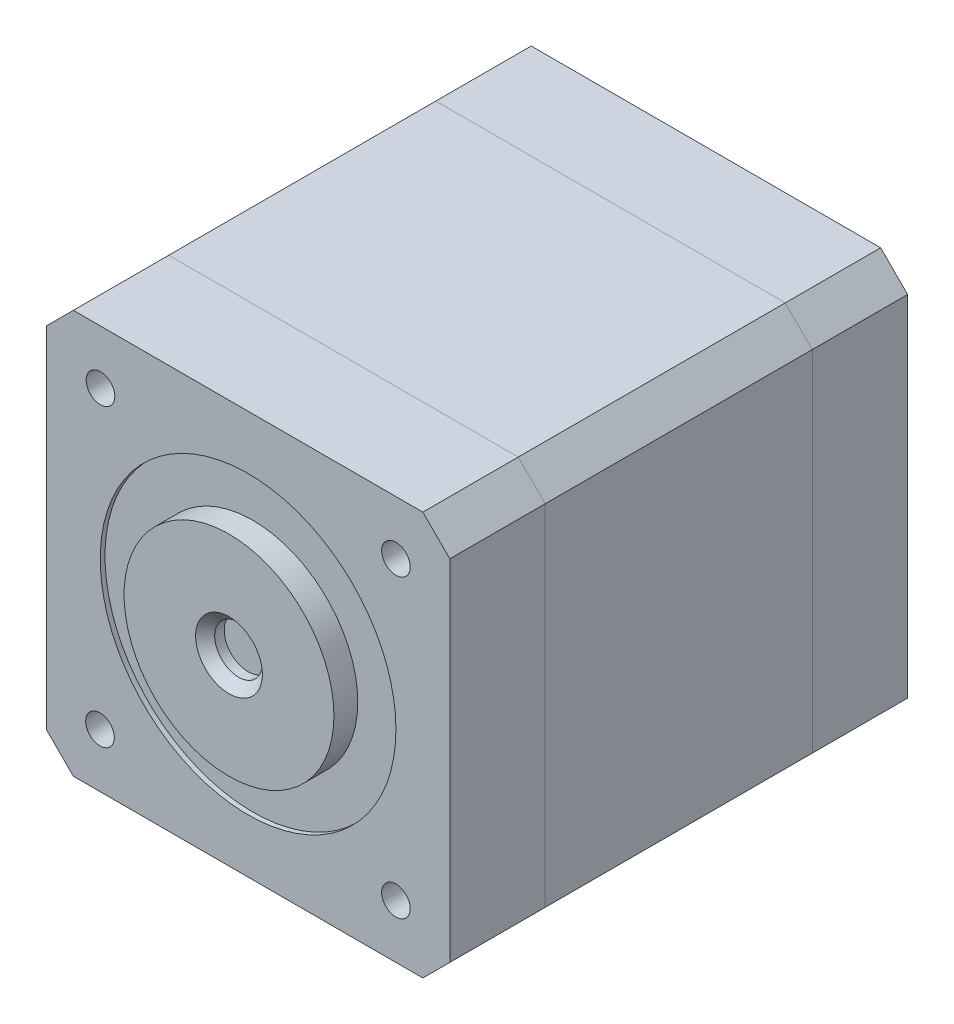
ISO-10303-21;
HEADER;
FILE_DESCRIPTION(('STEP AP214'),'2;1');
FILE_NAME('part.step','',(''),(''),'','','');
FILE_SCHEMA(('AUTOMOTIVE_DESIGN { 1 0 10303 214 1 1 1 1 }'));
ENDSEC;
DATA;
#1=APPLICATION_CONTEXT('core data for automotive mechanical design processes');
#2=APPLICATION_PROTOCOL_DEFINITION('international standard','automotive_design',2000,#1);
#3=PRODUCT_CONTEXT('',#1,'mechanical');
#4=PRODUCT('Part','Part','',(#3));
#5=PRODUCT_RELATED_PRODUCT_CATEGORY('part','',(#4));
#6=PRODUCT_DEFINITION_FORMATION('','',#4);
#7=PRODUCT_DEFINITION_CONTEXT('part definition',#1,'design');
#8=PRODUCT_DEFINITION('design','',#6,#7);
#9=PRODUCT_DEFINITION_SHAPE('','',#8);
#10=(LENGTH_UNIT() NAMED_UNIT(*) SI_UNIT(.MILLI.,.METRE.));
#11=(NAMED_UNIT(*) PLANE_ANGLE_UNIT() SI_UNIT($,.RADIAN.));
#12=(NAMED_UNIT(*) SI_UNIT($,.STERADIAN.) SOLID_ANGLE_UNIT());
#13=UNCERTAINTY_MEASURE_WITH_UNIT(LENGTH_MEASURE(1.E-05),#10,'distance_accuracy_value','');
#14=(GEOMETRIC_REPRESENTATION_CONTEXT(3) GLOBAL_UNCERTAINTY_ASSIGNED_CONTEXT((#13)) GLOBAL_UNIT_ASSIGNED_CONTEXT((#10,
#11,#12)) REPRESENTATION_CONTEXT('',''));
#15=CARTESIAN_POINT('',(0.,0.,0.));
#16=DIRECTION('',(0.,0.,1.));
#17=DIRECTION('',(1.,0.,0.));
#18=AXIS2_PLACEMENT_3D('',#15,#16,#17);
#19=CARTESIAN_POINT('',(-18.3215728752537,21.1499999999998,-48.));
#20=DIRECTION('',(0.,-1.,0.));
#21=DIRECTION('',(1.,0.,0.));
#22=AXIS2_PLACEMENT_3D('',#19,#20,#21);
#23=PLANE('',#22);
#24=DIRECTION('',(1.,0.,0.));
#25=VECTOR('',#24,1.);
#26=CARTESIAN_POINT('',(-18.3215728752537,21.1499999999998,-38.));
#27=LINE('',#26,#25);
#28=CARTESIAN_POINT('',(-18.3215728752537,21.1499999999998,-38.));
#29=VERTEX_POINT('',#28);
#30=CARTESIAN_POINT('',(18.3215728752538,21.15,-38.));
#31=VERTEX_POINT('',#30);
#32=EDGE_CURVE('E146',#29,#31,#27,.T.);
#33=ORIENTED_EDGE('',*,*,#32,.T.);
#34=DIRECTION('',(0.,0.,1.));
#35=VECTOR('',#34,1.);
#36=CARTESIAN_POINT('',(18.3215728752538,21.15,-48.));
#37=LINE('',#36,#35);
#38=CARTESIAN_POINT('',(18.3215728752538,21.15,-48.));
#39=VERTEX_POINT('',#38);
#40=EDGE_CURVE('E12',#39,#31,#37,.T.);
#41=ORIENTED_EDGE('',*,*,#40,.F.);
#42=DIRECTION('',(1.,0.,0.));
#43=VECTOR('',#42,1.);
#44=CARTESIAN_POINT('',(-18.3215728752537,21.1499999999998,-48.));
#45=LINE('',#44,#43);
#46=CARTESIAN_POINT('',(-18.3215728752537,21.1499999999998,-48.));
#47=VERTEX_POINT('',#46);
#48=EDGE_CURVE('E160',#47,#39,#45,.T.);
#49=ORIENTED_EDGE('',*,*,#48,.F.);
#50=DIRECTION('',(0.,0.,1.));
#51=VECTOR('',#50,1.);
#52=CARTESIAN_POINT('',(-18.3215728752537,21.1499999999998,-48.));
#53=LINE('',#52,#51);
#54=EDGE_CURVE('E142',#47,#29,#53,.T.);
#55=ORIENTED_EDGE('',*,*,#54,.T.);
#56=EDGE_LOOP('',(#33,#41,#49,#55));
#57=FACE_BOUND('',#56,.T.);
#58=ADVANCED_FACE('F50',(#57),#23,.F.);
#59=CARTESIAN_POINT('',(18.3215728752538,21.15,-48.));
#60=DIRECTION('',(-0.707106781186548,-0.707106781186548,0.));
#61=DIRECTION('',(0.707106781186548,-0.707106781186548,0.));
#62=AXIS2_PLACEMENT_3D('',#59,#60,#61);
#63=PLANE('',#62);
#64=DIRECTION('',(0.707106781186547,-0.707106781186547,0.));
#65=VECTOR('',#64,1.);
#66=CARTESIAN_POINT('',(18.3215728752538,21.15,-38.));
#67=LINE('',#66,#65);
#68=CARTESIAN_POINT('',(21.15,18.3215728752538,-38.));
#69=VERTEX_POINT('',#68);
#70=EDGE_CURVE('E149',#31,#69,#67,.T.);
#71=ORIENTED_EDGE('',*,*,#70,.T.);
#72=DIRECTION('',(0.,0.,1.));
#73=VECTOR('',#72,1.);
#74=CARTESIAN_POINT('',(21.15,18.3215728752538,-48.));
#75=LINE('',#74,#73);
#76=CARTESIAN_POINT('',(21.15,18.3215728752538,-48.));
#77=VERTEX_POINT('',#76);
#78=EDGE_CURVE('E58',#77,#69,#75,.T.);
#79=ORIENTED_EDGE('',*,*,#78,.F.);
#80=DIRECTION('',(0.707106781186547,-0.707106781186547,0.));
#81=VECTOR('',#80,1.);
#82=CARTESIAN_POINT('',(18.3215728752538,21.15,-48.));
#83=LINE('',#82,#81);
#84=EDGE_CURVE('E109',#39,#77,#83,.T.);
#85=ORIENTED_EDGE('',*,*,#84,.F.);
#86=ORIENTED_EDGE('',*,*,#40,.T.);
#87=EDGE_LOOP('',(#71,#79,#85,#86));
#88=FACE_BOUND('',#87,.T.);
#89=ADVANCED_FACE('F195',(#88),#63,.F.);
#90=CARTESIAN_POINT('',(21.15,18.3215728752538,-48.));
#91=DIRECTION('',(-1.,0.,0.));
#92=DIRECTION('',(0.,0.,1.));
#93=AXIS2_PLACEMENT_3D('',#90,#91,#92);
#94=PLANE('',#93);
#95=DIRECTION('',(0.,-1.,0.));
#96=VECTOR('',#95,1.);
#97=CARTESIAN_POINT('',(21.15,18.3215728752538,-38.));
#98=LINE('',#97,#96);
#99=CARTESIAN_POINT('',(21.15,-18.3215728752538,-38.));
#100=VERTEX_POINT('',#99);
#101=EDGE_CURVE('E151',#69,#100,#98,.T.);
#102=ORIENTED_EDGE('',*,*,#101,.T.);
#103=DIRECTION('',(0.,0.,1.));
#104=VECTOR('',#103,1.);
#105=CARTESIAN_POINT('',(21.15,-18.3215728752538,-48.));
#106=LINE('',#105,#104);
#107=CARTESIAN_POINT('',(21.15,-18.3215728752538,-48.));
#108=VERTEX_POINT('',#107);
#109=EDGE_CURVE('E167',#108,#100,#106,.T.);
#110=ORIENTED_EDGE('',*,*,#109,.F.);
#111=DIRECTION('',(0.,-1.,0.));
#112=VECTOR('',#111,1.);
#113=CARTESIAN_POINT('',(21.15,18.3215728752538,-48.));
#114=LINE('',#113,#112);
#115=EDGE_CURVE('E175',#77,#108,#114,.T.);
#116=ORIENTED_EDGE('',*,*,#115,.F.);
#117=ORIENTED_EDGE('',*,*,#78,.T.);
#118=EDGE_LOOP('',(#102,#110,#116,#117));
#119=FACE_BOUND('',#118,.T.);
#120=ADVANCED_FACE('F173',(#119),#94,.F.);
#121=CARTESIAN_POINT('',(21.15,-18.3215728752538,-48.));
#122=DIRECTION('',(-0.707106781186549,0.707106781186546,0.));
#123=DIRECTION('',(-0.707106781186546,-0.707106781186549,0.));
#124=AXIS2_PLACEMENT_3D('',#121,#122,#123);
#125=PLANE('',#124);
#126=DIRECTION('',(-0.707106781186546,-0.707106781186549,0.));
#127=VECTOR('',#126,1.);
#128=CARTESIAN_POINT('',(21.15,-18.3215728752538,-38.));
#129=LINE('',#128,#127);
#130=CARTESIAN_POINT('',(18.3215728752538,-21.15,-38.));
#131=VERTEX_POINT('',#130);
#132=EDGE_CURVE('E153',#100,#131,#129,.T.);
#133=ORIENTED_EDGE('',*,*,#132,.T.);
#134=DIRECTION('',(0.,0.,1.));
#135=VECTOR('',#134,1.);
#136=CARTESIAN_POINT('',(18.3215728752538,-21.15,-48.));
#137=LINE('',#136,#135);
#138=CARTESIAN_POINT('',(18.3215728752538,-21.15,-48.));
#139=VERTEX_POINT('',#138);
#140=EDGE_CURVE('E164',#139,#131,#137,.T.);
#141=ORIENTED_EDGE('',*,*,#140,.F.);
#142=DIRECTION('',(-0.707106781186546,-0.707106781186549,0.));
#143=VECTOR('',#142,1.);
#144=CARTESIAN_POINT('',(21.15,-18.3215728752538,-48.));
#145=LINE('',#144,#143);
#146=EDGE_CURVE('E187',#108,#139,#145,.T.);
#147=ORIENTED_EDGE('',*,*,#146,.F.);
#148=ORIENTED_EDGE('',*,*,#109,.T.);
#149=EDGE_LOOP('',(#133,#141,#147,#148));
#150=FACE_BOUND('',#149,.T.);
#151=ADVANCED_FACE('F183',(#150),#125,.F.);
#152=CARTESIAN_POINT('',(18.3215728752538,-21.15,-48.));
#153=DIRECTION('',(0.,1.,0.));
#154=DIRECTION('',(-1.,0.,0.));
#155=AXIS2_PLACEMENT_3D('',#152,#153,#154);
#156=PLANE('',#155);
#157=DIRECTION('',(-1.,0.,0.));
#158=VECTOR('',#157,1.);
#159=CARTESIAN_POINT('',(18.3215728752538,-21.15,-38.));
#160=LINE('',#159,#158);
#161=CARTESIAN_POINT('',(-18.3215728752535,-21.15,-38.));
#162=VERTEX_POINT('',#161);
#163=EDGE_CURVE('E155',#131,#162,#160,.T.);
#164=ORIENTED_EDGE('',*,*,#163,.T.);
#165=DIRECTION('',(0.,0.,1.));
#166=VECTOR('',#165,1.);
#167=CARTESIAN_POINT('',(-18.3215728752535,-21.15,-48.));
#168=LINE('',#167,#166);
#169=CARTESIAN_POINT('',(-18.3215728752535,-21.15,-48.));
#170=VERTEX_POINT('',#169);
#171=EDGE_CURVE('E137',#170,#162,#168,.T.);
#172=ORIENTED_EDGE('',*,*,#171,.F.);
#173=DIRECTION('',(-1.,0.,0.));
#174=VECTOR('',#173,1.);
#175=CARTESIAN_POINT('',(18.3215728752538,-21.15,-48.));
#176=LINE('',#175,#174);
#177=EDGE_CURVE('E128',#139,#170,#176,.T.);
#178=ORIENTED_EDGE('',*,*,#177,.F.);
#179=ORIENTED_EDGE('',*,*,#140,.T.);
#180=EDGE_LOOP('',(#164,#172,#178,#179));
#181=FACE_BOUND('',#180,.T.);
#182=ADVANCED_FACE('F186',(#181),#156,.F.);
#183=CARTESIAN_POINT('',(-18.3215728752535,-21.15,-48.));
#184=DIRECTION('',(0.707106781186512,0.707106781186583,0.));
#185=DIRECTION('',(-0.707106781186583,0.707106781186512,0.));
#186=AXIS2_PLACEMENT_3D('',#183,#184,#185);
#187=PLANE('',#186);
#188=DIRECTION('',(-0.707106781186583,0.707106781186512,0.));
#189=VECTOR('',#188,1.);
#190=CARTESIAN_POINT('',(-18.3215728752535,-21.15,-38.));
#191=LINE('',#190,#189);
#192=CARTESIAN_POINT('',(-21.15,-18.3215728752538,-38.));
#193=VERTEX_POINT('',#192);
#194=EDGE_CURVE('E136',#162,#193,#191,.T.);
#195=ORIENTED_EDGE('',*,*,#194,.T.);
#196=DIRECTION('',(0.,0.,1.));
#197=VECTOR('',#196,1.);
#198=CARTESIAN_POINT('',(-21.15,-18.3215728752538,-48.));
#199=LINE('',#198,#197);
#200=CARTESIAN_POINT('',(-21.15,-18.3215728752538,-48.));
#201=VERTEX_POINT('',#200);
#202=EDGE_CURVE('E133',#201,#193,#199,.T.);
#203=ORIENTED_EDGE('',*,*,#202,.F.);
#204=DIRECTION('',(-0.707106781186583,0.707106781186512,0.));
#205=VECTOR('',#204,1.);
#206=CARTESIAN_POINT('',(-18.3215728752535,-21.15,-48.));
#207=LINE('',#206,#205);
#208=EDGE_CURVE('E122',#170,#201,#207,.T.);
#209=ORIENTED_EDGE('',*,*,#208,.F.);
#210=ORIENTED_EDGE('',*,*,#171,.T.);
#211=EDGE_LOOP('',(#195,#203,#209,#210));
#212=FACE_BOUND('',#211,.T.);
#213=ADVANCED_FACE('F134',(#212),#187,.F.);
#214=CARTESIAN_POINT('',(-21.15,-18.3215728752538,-48.));
#215=DIRECTION('',(1.,0.,0.));
#216=DIRECTION('',(0.,1.,0.));
#217=AXIS2_PLACEMENT_3D('',#214,#215,#216);
#218=PLANE('',#217);
#219=DIRECTION('',(0.,1.,0.));
#220=VECTOR('',#219,1.);
#221=CARTESIAN_POINT('',(-21.15,-18.3215728752538,-38.));
#222=LINE('',#221,#220);
#223=CARTESIAN_POINT('',(-21.15,18.3215728752538,-38.));
#224=VERTEX_POINT('',#223);
#225=EDGE_CURVE('E95',#193,#224,#222,.T.);
#226=ORIENTED_EDGE('',*,*,#225,.T.);
#227=DIRECTION('',(0.,0.,1.));
#228=VECTOR('',#227,1.);
#229=CARTESIAN_POINT('',(-21.15,18.3215728752538,-48.));
#230=LINE('',#229,#228);
#231=CARTESIAN_POINT('',(-21.15,18.3215728752538,-48.));
#232=VERTEX_POINT('',#231);
#233=EDGE_CURVE('E138',#232,#224,#230,.T.);
#234=ORIENTED_EDGE('',*,*,#233,.F.);
#235=DIRECTION('',(0.,1.,0.));
#236=VECTOR('',#235,1.);
#237=CARTESIAN_POINT('',(-21.15,-18.3215728752538,-48.));
#238=LINE('',#237,#236);
#239=EDGE_CURVE('E126',#201,#232,#238,.T.);
#240=ORIENTED_EDGE('',*,*,#239,.F.);
#241=ORIENTED_EDGE('',*,*,#202,.T.);
#242=EDGE_LOOP('',(#226,#234,#240,#241));
#243=FACE_BOUND('',#242,.T.);
#244=ADVANCED_FACE('F140',(#243),#218,.F.);
#245=CARTESIAN_POINT('',(-21.15,18.3215728752538,-48.));
#246=DIRECTION('',(0.707106781186511,-0.707106781186584,0.));
#247=DIRECTION('',(0.707106781186584,0.707106781186511,0.));
#248=AXIS2_PLACEMENT_3D('',#245,#246,#247);
#249=PLANE('',#248);
#250=DIRECTION('',(0.707106781186584,0.707106781186511,0.));
#251=VECTOR('',#250,1.);
#252=CARTESIAN_POINT('',(-21.15,18.3215728752538,-38.));
#253=LINE('',#252,#251);
#254=EDGE_CURVE('E101',#224,#29,#253,.T.);
#255=ORIENTED_EDGE('',*,*,#254,.T.);
#256=ORIENTED_EDGE('',*,*,#54,.F.);
#257=DIRECTION('',(0.707106781186584,0.707106781186511,0.));
#258=VECTOR('',#257,1.);
#259=CARTESIAN_POINT('',(-21.15,18.3215728752538,-48.));
#260=LINE('',#259,#258);
#261=EDGE_CURVE('E66',#232,#47,#260,.T.);
#262=ORIENTED_EDGE('',*,*,#261,.F.);
#263=ORIENTED_EDGE('',*,*,#233,.T.);
#264=EDGE_LOOP('',(#255,#256,#262,#263));
#265=FACE_BOUND('',#264,.T.);
#266=ADVANCED_FACE('F211',(#265),#249,.F.);
#267=CARTESIAN_POINT('',(21.15,21.15,-48.));
#268=DIRECTION('',(0.,0.,-1.));
#269=DIRECTION('',(-1.,0.,0.));
#270=AXIS2_PLACEMENT_3D('',#267,#268,#269);
#271=PLANE('',#270);
#272=ORIENTED_EDGE('',*,*,#48,.T.);
#273=ORIENTED_EDGE('',*,*,#84,.T.);
#274=ORIENTED_EDGE('',*,*,#115,.T.);
#275=ORIENTED_EDGE('',*,*,#146,.T.);
#276=ORIENTED_EDGE('',*,*,#177,.T.);
#277=ORIENTED_EDGE('',*,*,#208,.T.);
#278=ORIENTED_EDGE('',*,*,#239,.T.);
#279=ORIENTED_EDGE('',*,*,#261,.T.);
#280=EDGE_LOOP('',(#272,#273,#274,#275,#276,#277,#278,#279));
#281=FACE_BOUND('',#280,.T.);
#282=ADVANCED_FACE('F124',(#281),#271,.T.);
#283=CARTESIAN_POINT('',(21.15,21.15,-38.));
#284=DIRECTION('',(0.,0.,-1.));
#285=DIRECTION('',(-1.,0.,0.));
#286=AXIS2_PLACEMENT_3D('',#283,#284,#285);
#287=PLANE('',#286);
#288=ORIENTED_EDGE('',*,*,#32,.F.);
#289=ORIENTED_EDGE('',*,*,#254,.F.);
#290=ORIENTED_EDGE('',*,*,#225,.F.);
#291=ORIENTED_EDGE('',*,*,#194,.F.);
#292=ORIENTED_EDGE('',*,*,#163,.F.);
#293=ORIENTED_EDGE('',*,*,#132,.F.);
#294=ORIENTED_EDGE('',*,*,#101,.F.);
#295=ORIENTED_EDGE('',*,*,#70,.F.);
#296=EDGE_LOOP('',(#288,#289,#290,#291,#292,#293,#294,#295));
#297=FACE_BOUND('',#296,.T.);
#298=ADVANCED_FACE('F179',(#297),#287,.F.);
#299=CLOSED_SHELL('',(#58,#89,#120,#151,#182,#213,#244,#266,#282,#298));
#300=MANIFOLD_SOLID_BREP('B2',#299);
#301=CARTESIAN_POINT('',(18.3215728752538,21.15,-38.));
#302=DIRECTION('',(-0.707106781186548,-0.707106781186548,0.));
#303=DIRECTION('',(0.707106781186548,-0.707106781186548,0.));
#304=AXIS2_PLACEMENT_3D('',#301,#302,#303);
#305=PLANE('',#304);
#306=DIRECTION('',(0.707106781186547,-0.707106781186547,0.));
#307=VECTOR('',#306,1.);
#308=CARTESIAN_POINT('',(18.3215728752538,21.15,-10.));
#309=LINE('',#308,#307);
#310=CARTESIAN_POINT('',(18.3215728752538,21.15,-10.));
#311=VERTEX_POINT('',#310);
#312=CARTESIAN_POINT('',(21.15,18.3215728752538,-10.));
#313=VERTEX_POINT('',#312);
#314=EDGE_CURVE('E383',#311,#313,#309,.T.);
#315=ORIENTED_EDGE('',*,*,#314,.T.);
#316=DIRECTION('',(0.,0.,1.));
#317=VECTOR('',#316,1.);
#318=CARTESIAN_POINT('',(21.15,18.3215728752538,-38.));
#319=LINE('',#318,#317);
#320=CARTESIAN_POINT('',(21.15,18.3215728752538,-38.));
#321=VERTEX_POINT('',#320);
#322=EDGE_CURVE('E48',#321,#313,#319,.T.);
#323=ORIENTED_EDGE('',*,*,#322,.F.);
#324=DIRECTION('',(0.707106781186547,-0.707106781186547,0.));
#325=VECTOR('',#324,1.);
#326=CARTESIAN_POINT('',(18.3215728752538,21.15,-38.));
#327=LINE('',#326,#325);
#328=CARTESIAN_POINT('',(18.3215728752538,21.15,-38.));
#329=VERTEX_POINT('',#328);
#330=EDGE_CURVE('E397',#329,#321,#327,.T.);
#331=ORIENTED_EDGE('',*,*,#330,.F.);
#332=DIRECTION('',(0.,0.,1.));
#333=VECTOR('',#332,1.);
#334=CARTESIAN_POINT('',(18.3215728752538,21.15,-38.));
#335=LINE('',#334,#333);
#336=EDGE_CURVE('E379',#329,#311,#335,.T.);
#337=ORIENTED_EDGE('',*,*,#336,.T.);
#338=EDGE_LOOP('',(#315,#323,#331,#337));
#339=FACE_BOUND('',#338,.T.);
#340=ADVANCED_FACE('F287',(#339),#305,.F.);
#341=CARTESIAN_POINT('',(21.15,18.3215728752538,-38.));
#342=DIRECTION('',(-1.,0.,0.));
#343=DIRECTION('',(0.,0.,1.));
#344=AXIS2_PLACEMENT_3D('',#341,#342,#343);
#345=PLANE('',#344);
#346=DIRECTION('',(0.,-1.,0.));
#347=VECTOR('',#346,1.);
#348=CARTESIAN_POINT('',(21.15,18.3215728752538,-10.));
#349=LINE('',#348,#347);
#350=CARTESIAN_POINT('',(21.15,-18.3215728752538,-10.));
#351=VERTEX_POINT('',#350);
#352=EDGE_CURVE('E386',#313,#351,#349,.T.);
#353=ORIENTED_EDGE('',*,*,#352,.T.);
#354=DIRECTION('',(0.,0.,1.));
#355=VECTOR('',#354,1.);
#356=CARTESIAN_POINT('',(21.15,-18.3215728752538,-38.));
#357=LINE('',#356,#355);
#358=CARTESIAN_POINT('',(21.15,-18.3215728752538,-38.));
#359=VERTEX_POINT('',#358);
#360=EDGE_CURVE('E295',#359,#351,#357,.T.);
#361=ORIENTED_EDGE('',*,*,#360,.F.);
#362=DIRECTION('',(0.,-1.,0.));
#363=VECTOR('',#362,1.);
#364=CARTESIAN_POINT('',(21.15,18.3215728752538,-38.));
#365=LINE('',#364,#363);
#366=EDGE_CURVE('E346',#321,#359,#365,.T.);
#367=ORIENTED_EDGE('',*,*,#366,.F.);
#368=ORIENTED_EDGE('',*,*,#322,.T.);
#369=EDGE_LOOP('',(#353,#361,#367,#368));
#370=FACE_BOUND('',#369,.T.);
#371=ADVANCED_FACE('F432',(#370),#345,.F.);
#372=CARTESIAN_POINT('',(21.15,-18.3215728752538,-38.));
#373=DIRECTION('',(-0.707106781186549,0.707106781186546,0.));
#374=DIRECTION('',(-0.707106781186546,-0.707106781186549,0.));
#375=AXIS2_PLACEMENT_3D('',#372,#373,#374);
#376=PLANE('',#375);
#377=DIRECTION('',(-0.707106781186546,-0.707106781186549,0.));
#378=VECTOR('',#377,1.);
#379=CARTESIAN_POINT('',(21.15,-18.3215728752538,-10.));
#380=LINE('',#379,#378);
#381=CARTESIAN_POINT('',(18.3215728752538,-21.15,-10.));
#382=VERTEX_POINT('',#381);
#383=EDGE_CURVE('E388',#351,#382,#380,.T.);
#384=ORIENTED_EDGE('',*,*,#383,.T.);
#385=DIRECTION('',(0.,0.,1.));
#386=VECTOR('',#385,1.);
#387=CARTESIAN_POINT('',(18.3215728752538,-21.15,-38.));
#388=LINE('',#387,#386);
#389=CARTESIAN_POINT('',(18.3215728752538,-21.15,-38.));
#390=VERTEX_POINT('',#389);
#391=EDGE_CURVE('E404',#390,#382,#388,.T.);
#392=ORIENTED_EDGE('',*,*,#391,.F.);
#393=DIRECTION('',(-0.707106781186546,-0.707106781186549,0.));
#394=VECTOR('',#393,1.);
#395=CARTESIAN_POINT('',(21.15,-18.3215728752538,-38.));
#396=LINE('',#395,#394);
#397=EDGE_CURVE('E412',#359,#390,#396,.T.);
#398=ORIENTED_EDGE('',*,*,#397,.F.);
#399=ORIENTED_EDGE('',*,*,#360,.T.);
#400=EDGE_LOOP('',(#384,#392,#398,#399));
#401=FACE_BOUND('',#400,.T.);
#402=ADVANCED_FACE('F410',(#401),#376,.F.);
#403=CARTESIAN_POINT('',(18.3215728752538,-21.15,-38.));
#404=DIRECTION('',(0.,1.,0.));
#405=DIRECTION('',(-1.,0.,0.));
#406=AXIS2_PLACEMENT_3D('',#403,#404,#405);
#407=PLANE('',#406);
#408=DIRECTION('',(-1.,0.,0.));
#409=VECTOR('',#408,1.);
#410=CARTESIAN_POINT('',(18.3215728752538,-21.15,-10.));
#411=LINE('',#410,#409);
#412=CARTESIAN_POINT('',(-18.3215728752535,-21.15,-10.));
#413=VERTEX_POINT('',#412);
#414=EDGE_CURVE('E390',#382,#413,#411,.T.);
#415=ORIENTED_EDGE('',*,*,#414,.T.);
#416=DIRECTION('',(0.,0.,1.));
#417=VECTOR('',#416,1.);
#418=CARTESIAN_POINT('',(-18.3215728752535,-21.15,-38.));
#419=LINE('',#418,#417);
#420=CARTESIAN_POINT('',(-18.3215728752535,-21.15,-38.));
#421=VERTEX_POINT('',#420);
#422=EDGE_CURVE('E401',#421,#413,#419,.T.);
#423=ORIENTED_EDGE('',*,*,#422,.F.);
#424=DIRECTION('',(-1.,0.,0.));
#425=VECTOR('',#424,1.);
#426=CARTESIAN_POINT('',(18.3215728752538,-21.15,-38.));
#427=LINE('',#426,#425);
#428=EDGE_CURVE('E424',#390,#421,#427,.T.);
#429=ORIENTED_EDGE('',*,*,#428,.F.);
#430=ORIENTED_EDGE('',*,*,#391,.T.);
#431=EDGE_LOOP('',(#415,#423,#429,#430));
#432=FACE_BOUND('',#431,.T.);
#433=ADVANCED_FACE('F420',(#432),#407,.F.);
#434=CARTESIAN_POINT('',(-18.3215728752535,-21.15,-38.));
#435=DIRECTION('',(0.707106781186512,0.707106781186583,0.));
#436=DIRECTION('',(-0.707106781186583,0.707106781186512,0.));
#437=AXIS2_PLACEMENT_3D('',#434,#435,#436);
#438=PLANE('',#437);
#439=DIRECTION('',(-0.707106781186583,0.707106781186512,0.));
#440=VECTOR('',#439,1.);
#441=CARTESIAN_POINT('',(-18.3215728752535,-21.15,-10.));
#442=LINE('',#441,#440);
#443=CARTESIAN_POINT('',(-21.15,-18.3215728752538,-10.));
#444=VERTEX_POINT('',#443);
#445=EDGE_CURVE('E392',#413,#444,#442,.T.);
#446=ORIENTED_EDGE('',*,*,#445,.T.);
#447=DIRECTION('',(0.,0.,1.));
#448=VECTOR('',#447,1.);
#449=CARTESIAN_POINT('',(-21.15,-18.3215728752538,-38.));
#450=LINE('',#449,#448);
#451=CARTESIAN_POINT('',(-21.15,-18.3215728752538,-38.));
#452=VERTEX_POINT('',#451);
#453=EDGE_CURVE('E374',#452,#444,#450,.T.);
#454=ORIENTED_EDGE('',*,*,#453,.F.);
#455=DIRECTION('',(-0.707106781186583,0.707106781186512,0.));
#456=VECTOR('',#455,1.);
#457=CARTESIAN_POINT('',(-18.3215728752535,-21.15,-38.));
#458=LINE('',#457,#456);
#459=EDGE_CURVE('E365',#421,#452,#458,.T.);
#460=ORIENTED_EDGE('',*,*,#459,.F.);
#461=ORIENTED_EDGE('',*,*,#422,.T.);
#462=EDGE_LOOP('',(#446,#454,#460,#461));
#463=FACE_BOUND('',#462,.T.);
#464=ADVANCED_FACE('F423',(#463),#438,.F.);
#465=CARTESIAN_POINT('',(-21.15,-18.3215728752538,-38.));
#466=DIRECTION('',(1.,0.,0.));
#467=DIRECTION('',(0.,1.,0.));
#468=AXIS2_PLACEMENT_3D('',#465,#466,#467);
#469=PLANE('',#468);
#470=DIRECTION('',(0.,1.,0.));
#471=VECTOR('',#470,1.);
#472=CARTESIAN_POINT('',(-21.15,-18.3215728752538,-10.));
#473=LINE('',#472,#471);
#474=CARTESIAN_POINT('',(-21.15,18.3215728752538,-10.));
#475=VERTEX_POINT('',#474);
#476=EDGE_CURVE('E373',#444,#475,#473,.T.);
#477=ORIENTED_EDGE('',*,*,#476,.T.);
#478=DIRECTION('',(0.,0.,1.));
#479=VECTOR('',#478,1.);
#480=CARTESIAN_POINT('',(-21.15,18.3215728752538,-38.));
#481=LINE('',#480,#479);
#482=CARTESIAN_POINT('',(-21.15,18.3215728752538,-38.));
#483=VERTEX_POINT('',#482);
#484=EDGE_CURVE('E370',#483,#475,#481,.T.);
#485=ORIENTED_EDGE('',*,*,#484,.F.);
#486=DIRECTION('',(0.,1.,0.));
#487=VECTOR('',#486,1.);
#488=CARTESIAN_POINT('',(-21.15,-18.3215728752538,-38.));
#489=LINE('',#488,#487);
#490=EDGE_CURVE('E359',#452,#483,#489,.T.);
#491=ORIENTED_EDGE('',*,*,#490,.F.);
#492=ORIENTED_EDGE('',*,*,#453,.T.);
#493=EDGE_LOOP('',(#477,#485,#491,#492));
#494=FACE_BOUND('',#493,.T.);
#495=ADVANCED_FACE('F371',(#494),#469,.F.);
#496=CARTESIAN_POINT('',(-21.15,18.3215728752538,-38.));
#497=DIRECTION('',(0.707106781186511,-0.707106781186584,0.));
#498=DIRECTION('',(0.707106781186584,0.707106781186511,0.));
#499=AXIS2_PLACEMENT_3D('',#496,#497,#498);
#500=PLANE('',#499);
#501=DIRECTION('',(0.707106781186584,0.707106781186511,0.));
#502=VECTOR('',#501,1.);
#503=CARTESIAN_POINT('',(-21.15,18.3215728752538,-10.));
#504=LINE('',#503,#502);
#505=CARTESIAN_POINT('',(-18.3215728752537,21.1499999999998,-10.));
#506=VERTEX_POINT('',#505);
#507=EDGE_CURVE('E332',#475,#506,#504,.T.);
#508=ORIENTED_EDGE('',*,*,#507,.T.);
#509=DIRECTION('',(0.,0.,1.));
#510=VECTOR('',#509,1.);
#511=CARTESIAN_POINT('',(-18.3215728752537,21.1499999999998,-38.));
#512=LINE('',#511,#510);
#513=CARTESIAN_POINT('',(-18.3215728752537,21.1499999999998,-38.));
#514=VERTEX_POINT('',#513);
#515=EDGE_CURVE('E375',#514,#506,#512,.T.);
#516=ORIENTED_EDGE('',*,*,#515,.F.);
#517=DIRECTION('',(0.707106781186584,0.707106781186511,0.));
#518=VECTOR('',#517,1.);
#519=CARTESIAN_POINT('',(-21.15,18.3215728752538,-38.));
#520=LINE('',#519,#518);
#521=EDGE_CURVE('E363',#483,#514,#520,.T.);
#522=ORIENTED_EDGE('',*,*,#521,.F.);
#523=ORIENTED_EDGE('',*,*,#484,.T.);
#524=EDGE_LOOP('',(#508,#516,#522,#523));
#525=FACE_BOUND('',#524,.T.);
#526=ADVANCED_FACE('F377',(#525),#500,.F.);
#527=CARTESIAN_POINT('',(-18.3215728752537,21.1499999999998,-38.));
#528=DIRECTION('',(0.,-1.,0.));
#529=DIRECTION('',(1.,0.,0.));
#530=AXIS2_PLACEMENT_3D('',#527,#528,#529);
#531=PLANE('',#530);
#532=DIRECTION('',(1.,0.,0.));
#533=VECTOR('',#532,1.);
#534=CARTESIAN_POINT('',(-18.3215728752537,21.1499999999998,-10.));
#535=LINE('',#534,#533);
#536=EDGE_CURVE('E338',#506,#311,#535,.T.);
#537=ORIENTED_EDGE('',*,*,#536,.T.);
#538=ORIENTED_EDGE('',*,*,#336,.F.);
#539=DIRECTION('',(1.,0.,0.));
#540=VECTOR('',#539,1.);
#541=CARTESIAN_POINT('',(-18.3215728752537,21.1499999999998,-38.));
#542=LINE('',#541,#540);
#543=EDGE_CURVE('E303',#514,#329,#542,.T.);
#544=ORIENTED_EDGE('',*,*,#543,.F.);
#545=ORIENTED_EDGE('',*,*,#515,.T.);
#546=EDGE_LOOP('',(#537,#538,#544,#545));
#547=FACE_BOUND('',#546,.T.);
#548=ADVANCED_FACE('F448',(#547),#531,.F.);
#549=CARTESIAN_POINT('',(39.4715728752538,0.,-38.));
#550=DIRECTION('',(0.,0.,-1.));
#551=DIRECTION('',(-1.,0.,0.));
#552=AXIS2_PLACEMENT_3D('',#549,#550,#551);
#553=PLANE('',#552);
#554=ORIENTED_EDGE('',*,*,#330,.T.);
#555=ORIENTED_EDGE('',*,*,#366,.T.);
#556=ORIENTED_EDGE('',*,*,#397,.T.);
#557=ORIENTED_EDGE('',*,*,#428,.T.);
#558=ORIENTED_EDGE('',*,*,#459,.T.);
#559=ORIENTED_EDGE('',*,*,#490,.T.);
#560=ORIENTED_EDGE('',*,*,#521,.T.);
#561=ORIENTED_EDGE('',*,*,#543,.T.);
#562=EDGE_LOOP('',(#554,#555,#556,#557,#558,#559,#560,#561));
#563=FACE_BOUND('',#562,.T.);
#564=ADVANCED_FACE('F361',(#563),#553,.T.);
#565=CARTESIAN_POINT('',(39.4715728752538,0.,-10.));
#566=DIRECTION('',(0.,0.,-1.));
#567=DIRECTION('',(-1.,0.,0.));
#568=AXIS2_PLACEMENT_3D('',#565,#566,#567);
#569=PLANE('',#568);
#570=ORIENTED_EDGE('',*,*,#314,.F.);
#571=ORIENTED_EDGE('',*,*,#536,.F.);
#572=ORIENTED_EDGE('',*,*,#507,.F.);
#573=ORIENTED_EDGE('',*,*,#476,.F.);
#574=ORIENTED_EDGE('',*,*,#445,.F.);
#575=ORIENTED_EDGE('',*,*,#414,.F.);
#576=ORIENTED_EDGE('',*,*,#383,.F.);
#577=ORIENTED_EDGE('',*,*,#352,.F.);
#578=EDGE_LOOP('',(#570,#571,#572,#573,#574,#575,#576,#577));
#579=FACE_BOUND('',#578,.T.);
#580=ADVANCED_FACE('F416',(#579),#569,.F.);
#581=CLOSED_SHELL('',(#340,#371,#402,#433,#464,#495,#526,#548,#564,#580));
#582=MANIFOLD_SOLID_BREP('B6',#581);
#583=CARTESIAN_POINT('',(21.15,0.,-10.));
#584=DIRECTION('',(-1.,0.,0.));
#585=DIRECTION('',(0.,0.,1.));
#586=AXIS2_PLACEMENT_3D('',#583,#584,#585);
#587=PLANE('',#586);
#588=DIRECTION('',(0.,-1.,0.));
#589=VECTOR('',#588,1.);
#590=CARTESIAN_POINT('',(21.15,0.,0.));
#591=LINE('',#590,#589);
#592=CARTESIAN_POINT('',(21.15,18.3215728752538,0.));
#593=VERTEX_POINT('',#592);
#594=CARTESIAN_POINT('',(21.15,-18.3215728752538,0.));
#595=VERTEX_POINT('',#594);
#596=EDGE_CURVE('E614',#593,#595,#591,.T.);
#597=ORIENTED_EDGE('',*,*,#596,.T.);
#598=DIRECTION('',(0.,0.,1.));
#599=VECTOR('',#598,1.);
#600=CARTESIAN_POINT('',(21.15,-18.3215728752538,-10.));
#601=LINE('',#600,#599);
#602=CARTESIAN_POINT('',(21.15,-18.3215728752538,-10.));
#603=VERTEX_POINT('',#602);
#604=EDGE_CURVE('E634',#603,#595,#601,.T.);
#605=ORIENTED_EDGE('',*,*,#604,.F.);
#606=DIRECTION('',(0.,-1.,0.));
#607=VECTOR('',#606,1.);
#608=CARTESIAN_POINT('',(21.15,0.,-10.));
#609=LINE('',#608,#607);
#610=CARTESIAN_POINT('',(21.15,18.3215728752538,-10.));
#611=VERTEX_POINT('',#610);
#612=EDGE_CURVE('E633',#611,#603,#609,.T.);
#613=ORIENTED_EDGE('',*,*,#612,.F.);
#614=DIRECTION('',(0.,0.,1.));
#615=VECTOR('',#614,1.);
#616=CARTESIAN_POINT('',(21.15,18.3215728752538,-10.));
#617=LINE('',#616,#615);
#618=EDGE_CURVE('E613',#611,#593,#617,.T.);
#619=ORIENTED_EDGE('',*,*,#618,.T.);
#620=EDGE_LOOP('',(#597,#605,#613,#619));
#621=FACE_BOUND('',#620,.T.);
#622=ADVANCED_FACE('F515',(#621),#587,.F.);
#623=CARTESIAN_POINT('',(19.7357864376269,-19.7357864376269,-10.));
#624=DIRECTION('',(-0.707106781186548,0.707106781186547,0.));
#625=DIRECTION('',(-0.707106781186547,-0.707106781186548,0.));
#626=AXIS2_PLACEMENT_3D('',#623,#624,#625);
#627=PLANE('',#626);
#628=DIRECTION('',(-0.707106781186547,-0.707106781186548,0.));
#629=VECTOR('',#628,1.);
#630=CARTESIAN_POINT('',(19.7357864376269,-19.7357864376269,0.));
#631=LINE('',#630,#629);
#632=CARTESIAN_POINT('',(18.3215728752538,-21.15,0.));
#633=VERTEX_POINT('',#632);
#634=EDGE_CURVE('E567',#595,#633,#631,.T.);
#635=ORIENTED_EDGE('',*,*,#634,.T.);
#636=DIRECTION('',(0.,0.,1.));
#637=VECTOR('',#636,1.);
#638=CARTESIAN_POINT('',(18.3215728752538,-21.15,-10.));
#639=LINE('',#638,#637);
#640=CARTESIAN_POINT('',(18.3215728752538,-21.15,-10.));
#641=VERTEX_POINT('',#640);
#642=EDGE_CURVE('E560',#641,#633,#639,.T.);
#643=ORIENTED_EDGE('',*,*,#642,.F.);
#644=DIRECTION('',(-0.707106781186547,-0.707106781186548,0.));
#645=VECTOR('',#644,1.);
#646=CARTESIAN_POINT('',(19.7357864376269,-19.7357864376269,-10.));
#647=LINE('',#646,#645);
#648=EDGE_CURVE('E532',#603,#641,#647,.T.);
#649=ORIENTED_EDGE('',*,*,#648,.F.);
#650=ORIENTED_EDGE('',*,*,#604,.T.);
#651=EDGE_LOOP('',(#635,#643,#649,#650));
#652=FACE_BOUND('',#651,.T.);
#653=ADVANCED_FACE('F671',(#652),#627,.F.);
#654=CARTESIAN_POINT('',(0.,-21.15,-10.));
#655=DIRECTION('',(0.,-1.,0.));
#656=DIRECTION('',(1.,0.,0.));
#657=AXIS2_PLACEMENT_3D('',#654,#655,#656);
#658=PLANE('',#657);
#659=DIRECTION('',(1.,0.,0.));
#660=VECTOR('',#659,1.);
#661=CARTESIAN_POINT('',(0.,-21.15,0.));
#662=LINE('',#661,#660);
#663=CARTESIAN_POINT('',(-18.3215728752535,-21.15,0.));
#664=VERTEX_POINT('',#663);
#665=EDGE_CURVE('E592',#664,#633,#662,.T.);
#666=ORIENTED_EDGE('',*,*,#665,.F.);
#667=DIRECTION('',(0.,0.,1.));
#668=VECTOR('',#667,1.);
#669=CARTESIAN_POINT('',(-18.3215728752535,-21.15,-10.));
#670=LINE('',#669,#668);
#671=CARTESIAN_POINT('',(-18.3215728752535,-21.15,-10.));
#672=VERTEX_POINT('',#671);
#673=EDGE_CURVE('E588',#672,#664,#670,.T.);
#674=ORIENTED_EDGE('',*,*,#673,.F.);
#675=DIRECTION('',(1.,0.,0.));
#676=VECTOR('',#675,1.);
#677=CARTESIAN_POINT('',(0.,-21.15,-10.));
#678=LINE('',#677,#676);
#679=EDGE_CURVE('E591',#672,#641,#678,.T.);
#680=ORIENTED_EDGE('',*,*,#679,.T.);
#681=ORIENTED_EDGE('',*,*,#642,.T.);
#682=EDGE_LOOP('',(#666,#674,#680,#681));
#683=FACE_BOUND('',#682,.T.);
#684=ADVANCED_FACE('F590',(#683),#658,.T.);
#685=CARTESIAN_POINT('',(-19.7357864376258,-19.7357864376278,-10.));
#686=DIRECTION('',(-0.707106781186511,-0.707106781186584,0.));
#687=DIRECTION('',(0.707106781186584,-0.707106781186511,0.));
#688=AXIS2_PLACEMENT_3D('',#685,#686,#687);
#689=PLANE('',#688);
#690=DIRECTION('',(0.707106781186584,-0.707106781186511,0.));
#691=VECTOR('',#690,1.);
#692=CARTESIAN_POINT('',(-19.7357864376258,-19.7357864376278,0.));
#693=LINE('',#692,#691);
#694=CARTESIAN_POINT('',(-21.15,-18.3215728752538,0.));
#695=VERTEX_POINT('',#694);
#696=EDGE_CURVE('E629',#695,#664,#693,.T.);
#697=ORIENTED_EDGE('',*,*,#696,.F.);
#698=DIRECTION('',(0.,0.,1.));
#699=VECTOR('',#698,1.);
#700=CARTESIAN_POINT('',(-21.15,-18.3215728752538,-10.));
#701=LINE('',#700,#699);
#702=CARTESIAN_POINT('',(-21.15,-18.3215728752538,-10.));
#703=VERTEX_POINT('',#702);
#704=EDGE_CURVE('E597',#703,#695,#701,.T.);
#705=ORIENTED_EDGE('',*,*,#704,.F.);
#706=DIRECTION('',(0.707106781186584,-0.707106781186511,0.));
#707=VECTOR('',#706,1.);
#708=CARTESIAN_POINT('',(-19.7357864376258,-19.7357864376278,-10.));
#709=LINE('',#708,#707);
#710=EDGE_CURVE('E602',#703,#672,#709,.T.);
#711=ORIENTED_EDGE('',*,*,#710,.T.);
#712=ORIENTED_EDGE('',*,*,#673,.T.);
#713=EDGE_LOOP('',(#697,#705,#711,#712));
#714=FACE_BOUND('',#713,.T.);
#715=ADVANCED_FACE('F605',(#714),#689,.T.);
#716=CARTESIAN_POINT('',(-21.15,0.,-10.));
#717=DIRECTION('',(-1.,0.,0.));
#718=DIRECTION('',(0.,0.,1.));
#719=AXIS2_PLACEMENT_3D('',#716,#717,#718);
#720=PLANE('',#719);
#721=DIRECTION('',(0.,-1.,0.));
#722=VECTOR('',#721,1.);
#723=CARTESIAN_POINT('',(-21.15,0.,0.));
#724=LINE('',#723,#722);
#725=CARTESIAN_POINT('',(-21.15,18.3215728752538,0.));
#726=VERTEX_POINT('',#725);
#727=EDGE_CURVE('E626',#726,#695,#724,.T.);
#728=ORIENTED_EDGE('',*,*,#727,.F.);
#729=DIRECTION('',(0.,0.,1.));
#730=VECTOR('',#729,1.);
#731=CARTESIAN_POINT('',(-21.15,18.3215728752538,-10.));
#732=LINE('',#731,#730);
#733=CARTESIAN_POINT('',(-21.15,18.3215728752538,-10.));
#734=VERTEX_POINT('',#733);
#735=EDGE_CURVE('E639',#734,#726,#732,.T.);
#736=ORIENTED_EDGE('',*,*,#735,.F.);
#737=DIRECTION('',(0.,-1.,0.));
#738=VECTOR('',#737,1.);
#739=CARTESIAN_POINT('',(-21.15,0.,-10.));
#740=LINE('',#739,#738);
#741=EDGE_CURVE('E606',#734,#703,#740,.T.);
#742=ORIENTED_EDGE('',*,*,#741,.T.);
#743=ORIENTED_EDGE('',*,*,#704,.T.);
#744=EDGE_LOOP('',(#728,#736,#742,#743));
#745=FACE_BOUND('',#744,.T.);
#746=ADVANCED_FACE('F689',(#745),#720,.T.);
#747=CARTESIAN_POINT('',(-19.7357864376258,19.7357864376279,-10.));
#748=DIRECTION('',(-0.70710678118651,0.707106781186585,0.));
#749=DIRECTION('',(-0.707106781186585,-0.70710678118651,0.));
#750=AXIS2_PLACEMENT_3D('',#747,#748,#749);
#751=PLANE('',#750);
#752=DIRECTION('',(-0.707106781186585,-0.70710678118651,0.));
#753=VECTOR('',#752,1.);
#754=CARTESIAN_POINT('',(-19.7357864376258,19.7357864376279,0.));
#755=LINE('',#754,#753);
#756=CARTESIAN_POINT('',(-18.3215728752537,21.1499999999998,0.));
#757=VERTEX_POINT('',#756);
#758=EDGE_CURVE('E623',#757,#726,#755,.T.);
#759=ORIENTED_EDGE('',*,*,#758,.F.);
#760=DIRECTION('',(0.,0.,1.));
#761=VECTOR('',#760,1.);
#762=CARTESIAN_POINT('',(-18.3215728752537,21.1499999999998,-10.));
#763=LINE('',#762,#761);
#764=CARTESIAN_POINT('',(-18.3215728752537,21.1499999999998,-10.));
#765=VERTEX_POINT('',#764);
#766=EDGE_CURVE('E641',#765,#757,#763,.T.);
#767=ORIENTED_EDGE('',*,*,#766,.F.);
#768=DIRECTION('',(-0.707106781186585,-0.70710678118651,0.));
#769=VECTOR('',#768,1.);
#770=CARTESIAN_POINT('',(-19.7357864376258,19.7357864376279,-10.));
#771=LINE('',#770,#769);
#772=EDGE_CURVE('E608',#765,#734,#771,.T.);
#773=ORIENTED_EDGE('',*,*,#772,.T.);
#774=ORIENTED_EDGE('',*,*,#735,.T.);
#775=EDGE_LOOP('',(#759,#767,#773,#774));
#776=FACE_BOUND('',#775,.T.);
#777=ADVANCED_FACE('F685',(#776),#751,.T.);
#778=CARTESIAN_POINT('',(0.,21.1499999999999,-10.));
#779=DIRECTION('',(0.,1.,0.));
#780=DIRECTION('',(-1.,0.,0.));
#781=AXIS2_PLACEMENT_3D('',#778,#779,#780);
#782=PLANE('',#781);
#783=DIRECTION('',(-1.,0.,0.));
#784=VECTOR('',#783,1.);
#785=CARTESIAN_POINT('',(0.,21.1499999999999,0.));
#786=LINE('',#785,#784);
#787=CARTESIAN_POINT('',(18.3215728752538,21.15,0.));
#788=VERTEX_POINT('',#787);
#789=EDGE_CURVE('E620',#788,#757,#786,.T.);
#790=ORIENTED_EDGE('',*,*,#789,.F.);
#791=DIRECTION('',(0.,0.,1.));
#792=VECTOR('',#791,1.);
#793=CARTESIAN_POINT('',(18.3215728752538,21.15,-10.));
#794=LINE('',#793,#792);
#795=CARTESIAN_POINT('',(18.3215728752538,21.15,-10.));
#796=VERTEX_POINT('',#795);
#797=EDGE_CURVE('E643',#796,#788,#794,.T.);
#798=ORIENTED_EDGE('',*,*,#797,.F.);
#799=DIRECTION('',(-1.,0.,0.));
#800=VECTOR('',#799,1.);
#801=CARTESIAN_POINT('',(0.,21.1499999999999,-10.));
#802=LINE('',#801,#800);
#803=EDGE_CURVE('E786',#796,#765,#802,.T.);
#804=ORIENTED_EDGE('',*,*,#803,.T.);
#805=ORIENTED_EDGE('',*,*,#766,.T.);
#806=EDGE_LOOP('',(#790,#798,#804,#805));
#807=FACE_BOUND('',#806,.T.);
#808=ADVANCED_FACE('F681',(#807),#782,.T.);
#809=CARTESIAN_POINT('',(19.7357864376269,19.7357864376269,-10.));
#810=DIRECTION('',(-0.707106781186547,-0.707106781186548,0.));
#811=DIRECTION('',(0.707106781186548,-0.707106781186547,0.));
#812=AXIS2_PLACEMENT_3D('',#809,#810,#811);
#813=PLANE('',#812);
#814=DIRECTION('',(0.707106781186548,-0.707106781186547,0.));
#815=VECTOR('',#814,1.);
#816=CARTESIAN_POINT('',(19.7357864376269,19.7357864376269,0.));
#817=LINE('',#816,#815);
#818=EDGE_CURVE('E617',#788,#593,#817,.T.);
#819=ORIENTED_EDGE('',*,*,#818,.T.);
#820=ORIENTED_EDGE('',*,*,#618,.F.);
#821=DIRECTION('',(0.707106781186548,-0.707106781186547,0.));
#822=VECTOR('',#821,1.);
#823=CARTESIAN_POINT('',(19.7357864376269,19.7357864376269,-10.));
#824=LINE('',#823,#822);
#825=EDGE_CURVE('E574',#796,#611,#824,.T.);
#826=ORIENTED_EDGE('',*,*,#825,.F.);
#827=ORIENTED_EDGE('',*,*,#797,.T.);
#828=EDGE_LOOP('',(#819,#820,#826,#827));
#829=FACE_BOUND('',#828,.T.);
#830=ADVANCED_FACE('F678',(#829),#813,.F.);
#831=CARTESIAN_POINT('',(0.,0.,-10.));
#832=DIRECTION('',(0.,0.,1.));
#833=DIRECTION('',(1.,0.,0.));
#834=AXIS2_PLACEMENT_3D('',#831,#832,#833);
#835=PLANE('',#834);
#836=ORIENTED_EDGE('',*,*,#612,.T.);
#837=ORIENTED_EDGE('',*,*,#648,.T.);
#838=ORIENTED_EDGE('',*,*,#679,.F.);
#839=ORIENTED_EDGE('',*,*,#710,.F.);
#840=ORIENTED_EDGE('',*,*,#741,.F.);
#841=ORIENTED_EDGE('',*,*,#772,.F.);
#842=ORIENTED_EDGE('',*,*,#803,.F.);
#843=ORIENTED_EDGE('',*,*,#825,.T.);
#844=EDGE_LOOP('',(#836,#837,#838,#839,#840,#841,#842,#843));
#845=FACE_BOUND('',#844,.T.);
#846=ADVANCED_FACE('F600',(#845),#835,.F.);
#847=CARTESIAN_POINT('',(0.,0.,0.));
#848=DIRECTION('',(0.,0.,1.));
#849=DIRECTION('',(1.,0.,0.));
#850=AXIS2_PLACEMENT_3D('',#847,#848,#849);
#851=PLANE('',#850);
#852=CARTESIAN_POINT('',(15.5,15.5000000000001,0.));
#853=DIRECTION('',(0.,0.,1.));
#854=DIRECTION('',(1.,0.,0.));
#855=AXIS2_PLACEMENT_3D('',#852,#853,#854);
#856=CIRCLE('',#855,1.5);
#857=CARTESIAN_POINT('',(17.,15.5000000000001,0.));
#858=VERTEX_POINT('',#857);
#859=EDGE_CURVE('E751',#858,#858,#856,.T.);
#860=ORIENTED_EDGE('',*,*,#859,.F.);
#861=EDGE_LOOP('',(#860));
#862=FACE_BOUND('',#861,.T.);
#863=CARTESIAN_POINT('',(15.5000000000001,-15.526507359145,0.));
#864=DIRECTION('',(0.,0.,1.));
#865=DIRECTION('',(1.,0.,0.));
#866=AXIS2_PLACEMENT_3D('',#863,#864,#865);
#867=CIRCLE('',#866,1.5);
#868=CARTESIAN_POINT('',(17.0000000000001,-15.526507359145,0.));
#869=VERTEX_POINT('',#868);
#870=EDGE_CURVE('E762',#869,#869,#867,.T.);
#871=ORIENTED_EDGE('',*,*,#870,.F.);
#872=EDGE_LOOP('',(#871));
#873=FACE_BOUND('',#872,.T.);
#874=CARTESIAN_POINT('',(-15.5265073591447,-15.5000000000001,0.));
#875=DIRECTION('',(0.,0.,1.));
#876=DIRECTION('',(1.,0.,0.));
#877=AXIS2_PLACEMENT_3D('',#874,#875,#876);
#878=CIRCLE('',#877,1.5);
#879=CARTESIAN_POINT('',(-14.0265073591447,-15.5000000000001,0.));
#880=VERTEX_POINT('',#879);
#881=EDGE_CURVE('E768',#880,#880,#878,.T.);
#882=ORIENTED_EDGE('',*,*,#881,.F.);
#883=EDGE_LOOP('',(#882));
#884=FACE_BOUND('',#883,.T.);
#885=CARTESIAN_POINT('',(-15.4734472315132,15.4999545906579,0.));
#886=DIRECTION('',(0.,0.,1.));
#887=DIRECTION('',(1.,0.,0.));
#888=AXIS2_PLACEMENT_3D('',#885,#886,#887);
#889=CIRCLE('',#888,1.5);
#890=CARTESIAN_POINT('',(-13.9734472315132,15.4999545906579,0.));
#891=VERTEX_POINT('',#890);
#892=EDGE_CURVE('E750',#891,#891,#889,.T.);
#893=ORIENTED_EDGE('',*,*,#892,.F.);
#894=EDGE_LOOP('',(#893));
#895=FACE_BOUND('',#894,.T.);
#896=CARTESIAN_POINT('',(0.,0.,0.));
#897=DIRECTION('',(0.,0.,1.));
#898=DIRECTION('',(1.,0.,0.));
#899=AXIS2_PLACEMENT_3D('',#896,#897,#898);
#900=CIRCLE('',#899,15.5000000000001);
#901=CARTESIAN_POINT('',(15.5000000000001,0.,0.));
#902=VERTEX_POINT('',#901);
#903=EDGE_CURVE('E776',#902,#902,#900,.T.);
#904=ORIENTED_EDGE('',*,*,#903,.F.);
#905=EDGE_LOOP('',(#904));
#906=FACE_BOUND('',#905,.T.);
#907=ORIENTED_EDGE('',*,*,#596,.F.);
#908=ORIENTED_EDGE('',*,*,#818,.F.);
#909=ORIENTED_EDGE('',*,*,#789,.T.);
#910=ORIENTED_EDGE('',*,*,#758,.T.);
#911=ORIENTED_EDGE('',*,*,#727,.T.);
#912=ORIENTED_EDGE('',*,*,#696,.T.);
#913=ORIENTED_EDGE('',*,*,#665,.T.);
#914=ORIENTED_EDGE('',*,*,#634,.F.);
#915=EDGE_LOOP('',(#907,#908,#909,#910,#911,#912,#913,#914));
#916=FACE_BOUND('',#915,.T.);
#917=ADVANCED_FACE('F668',(#862,#873,#884,#895,#906,#916),#851,.T.);
#918=CARTESIAN_POINT('',(0.,0.,-0.5));
#919=DIRECTION('',(0.,0.,1.));
#920=DIRECTION('',(1.,0.,0.));
#921=AXIS2_PLACEMENT_3D('',#918,#919,#920);
#922=CYLINDRICAL_SURFACE('',#921,11.);
#923=CARTESIAN_POINT('',(0.,0.,-0.5));
#924=DIRECTION('',(0.,0.,1.));
#925=DIRECTION('',(1.,0.,0.));
#926=AXIS2_PLACEMENT_3D('',#923,#924,#925);
#927=CIRCLE('',#926,11.);
#928=CARTESIAN_POINT('',(11.,0.,-0.5));
#929=VERTEX_POINT('',#928);
#930=EDGE_CURVE('E777',#929,#929,#927,.T.);
#931=ORIENTED_EDGE('',*,*,#930,.T.);
#932=EDGE_LOOP('',(#931));
#933=FACE_BOUND('',#932,.T.);
#934=CARTESIAN_POINT('',(0.,0.,2.));
#935=DIRECTION('',(0.,0.,1.));
#936=DIRECTION('',(1.,0.,0.));
#937=AXIS2_PLACEMENT_3D('',#934,#935,#936);
#938=CIRCLE('',#937,11.);
#939=CARTESIAN_POINT('',(11.,0.,2.));
#940=VERTEX_POINT('',#939);
#941=EDGE_CURVE('E772',#940,#940,#938,.T.);
#942=ORIENTED_EDGE('',*,*,#941,.F.);
#943=EDGE_LOOP('',(#942));
#944=FACE_BOUND('',#943,.T.);
#945=ADVANCED_FACE('F699',(#933,#944),#922,.T.);
#946=CARTESIAN_POINT('',(0.,0.,-0.5));
#947=DIRECTION('',(0.,0.,1.));
#948=DIRECTION('',(1.,0.,0.));
#949=AXIS2_PLACEMENT_3D('',#946,#947,#948);
#950=CYLINDRICAL_SURFACE('',#949,15.5000000000001);
#951=CARTESIAN_POINT('',(0.,0.,-0.5));
#952=DIRECTION('',(0.,0.,1.));
#953=DIRECTION('',(1.,0.,0.));
#954=AXIS2_PLACEMENT_3D('',#951,#952,#953);
#955=CIRCLE('',#954,15.5000000000001);
#956=CARTESIAN_POINT('',(15.5000000000001,0.,-0.5));
#957=VERTEX_POINT('',#956);
#958=EDGE_CURVE('E618',#957,#957,#955,.T.);
#959=ORIENTED_EDGE('',*,*,#958,.F.);
#960=EDGE_LOOP('',(#959));
#961=FACE_BOUND('',#960,.T.);
#962=ORIENTED_EDGE('',*,*,#903,.T.);
#963=EDGE_LOOP('',(#962));
#964=FACE_BOUND('',#963,.T.);
#965=ADVANCED_FACE('F705',(#961,#964),#950,.F.);
#966=CARTESIAN_POINT('',(0.,0.,-0.5));
#967=DIRECTION('',(0.,0.,1.));
#968=DIRECTION('',(1.,0.,0.));
#969=AXIS2_PLACEMENT_3D('',#966,#967,#968);
#970=PLANE('',#969);
#971=ORIENTED_EDGE('',*,*,#930,.F.);
#972=EDGE_LOOP('',(#971));
#973=FACE_BOUND('',#972,.T.);
#974=ORIENTED_EDGE('',*,*,#958,.T.);
#975=EDGE_LOOP('',(#974));
#976=FACE_BOUND('',#975,.T.);
#977=ADVANCED_FACE('F709',(#973,#976),#970,.T.);
#978=CARTESIAN_POINT('',(0.,0.,2.));
#979=DIRECTION('',(0.,0.,-1.));
#980=DIRECTION('',(-1.,0.,0.));
#981=AXIS2_PLACEMENT_3D('',#978,#979,#980);
#982=CYLINDRICAL_SURFACE('',#981,2.49999999999999);
#983=CARTESIAN_POINT('',(0.,0.,0.999999999999983));
#984=DIRECTION('',(0.,0.,1.));
#985=DIRECTION('',(1.,0.,0.));
#986=AXIS2_PLACEMENT_3D('',#983,#984,#985);
#987=CIRCLE('',#986,2.49999999999999);
#988=CARTESIAN_POINT('',(2.49999999999999,0.,0.999999999999983));
#989=VERTEX_POINT('',#988);
#990=EDGE_CURVE('E524',#989,#989,#987,.T.);
#991=ORIENTED_EDGE('',*,*,#990,.T.);
#992=EDGE_LOOP('',(#991));
#993=FACE_BOUND('',#992,.T.);
#994=CARTESIAN_POINT('',(0.,0.,0.));
#995=DIRECTION('',(0.,0.,1.));
#996=DIRECTION('',(1.,0.,0.));
#997=AXIS2_PLACEMENT_3D('',#994,#995,#996);
#998=CIRCLE('',#997,2.49999999999999);
#999=CARTESIAN_POINT('',(2.49999999999999,0.,0.));
#1000=VERTEX_POINT('',#999);
#1001=EDGE_CURVE('E636',#1000,#1000,#998,.F.);
#1002=ORIENTED_EDGE('',*,*,#1001,.T.);
#1003=EDGE_LOOP('',(#1002));
#1004=FACE_BOUND('',#1003,.T.);
#1005=ADVANCED_FACE('F651',(#993,#1004),#982,.F.);
#1006=CARTESIAN_POINT('',(0.,0.,2.));
#1007=DIRECTION('',(0.,0.,1.));
#1008=DIRECTION('',(1.,0.,0.));
#1009=AXIS2_PLACEMENT_3D('',#1006,#1007,#1008);
#1010=PLANE('',#1009);
#1011=CARTESIAN_POINT('',(0.,0.,2.));
#1012=DIRECTION('',(0.,0.,1.));
#1013=DIRECTION('',(1.,0.,0.));
#1014=AXIS2_PLACEMENT_3D('',#1011,#1012,#1013);
#1015=CIRCLE('',#1014,3.50000000000001);
#1016=CARTESIAN_POINT('',(3.50000000000001,0.,2.));
#1017=VERTEX_POINT('',#1016);
#1018=EDGE_CURVE('E285',#1017,#1017,#1015,.F.);
#1019=ORIENTED_EDGE('',*,*,#1018,.T.);
#1020=EDGE_LOOP('',(#1019));
#1021=FACE_BOUND('',#1020,.T.);
#1022=ORIENTED_EDGE('',*,*,#941,.T.);
#1023=EDGE_LOOP('',(#1022));
#1024=FACE_BOUND('',#1023,.T.);
#1025=ADVANCED_FACE('F665',(#1021,#1024),#1010,.T.);
#1026=ORIENTED_EDGE('',*,*,#1001,.F.);
#1027=EDGE_LOOP('',(#1026));
#1028=FACE_BOUND('',#1027,.T.);
#1029=ADVANCED_FACE('F656',(#1028),#851,.T.);
#1030=CARTESIAN_POINT('',(0.,0.,0.999999999999983));
#1031=DIRECTION('',(0.,0.,1.));
#1032=DIRECTION('',(1.,0.,0.));
#1033=AXIS2_PLACEMENT_3D('',#1030,#1031,#1032);
#1034=CONICAL_SURFACE('',#1033,2.49999999999999,0.785398163397448);
#1035=ORIENTED_EDGE('',*,*,#1018,.F.);
#1036=EDGE_LOOP('',(#1035));
#1037=FACE_BOUND('',#1036,.T.);
#1038=ORIENTED_EDGE('',*,*,#990,.F.);
#1039=EDGE_LOOP('',(#1038));
#1040=FACE_BOUND('',#1039,.T.);
#1041=ADVANCED_FACE('F517',(#1037,#1040),#1034,.F.);
#1042=CARTESIAN_POINT('',(-15.4734472315132,15.4999545906579,-3.));
#1043=DIRECTION('',(0.,0.,1.));
#1044=DIRECTION('',(1.,0.,0.));
#1045=AXIS2_PLACEMENT_3D('',#1042,#1043,#1044);
#1046=CYLINDRICAL_SURFACE('',#1045,1.5);
#1047=CARTESIAN_POINT('',(-15.4734472315132,15.4999545906579,-3.));
#1048=DIRECTION('',(0.,0.,1.));
#1049=DIRECTION('',(1.,0.,0.));
#1050=AXIS2_PLACEMENT_3D('',#1047,#1048,#1049);
#1051=CIRCLE('',#1050,1.5);
#1052=CARTESIAN_POINT('',(-13.9734472315132,15.4999545906579,-3.));
#1053=VERTEX_POINT('',#1052);
#1054=EDGE_CURVE('E754',#1053,#1053,#1051,.T.);
#1055=ORIENTED_EDGE('',*,*,#1054,.F.);
#1056=EDGE_LOOP('',(#1055));
#1057=FACE_BOUND('',#1056,.T.);
#1058=ORIENTED_EDGE('',*,*,#892,.T.);
#1059=EDGE_LOOP('',(#1058));
#1060=FACE_BOUND('',#1059,.T.);
#1061=ADVANCED_FACE('F655',(#1057,#1060),#1046,.F.);
#1062=CARTESIAN_POINT('',(-15.4734472315132,15.4999545906579,-3.));
#1063=DIRECTION('',(0.,0.,1.));
#1064=DIRECTION('',(1.,0.,0.));
#1065=AXIS2_PLACEMENT_3D('',#1062,#1063,#1064);
#1066=PLANE('',#1065);
#1067=ORIENTED_EDGE('',*,*,#1054,.T.);
#1068=EDGE_LOOP('',(#1067));
#1069=FACE_BOUND('',#1068,.T.);
#1070=ADVANCED_FACE('F662',(#1069),#1066,.T.);
#1071=CARTESIAN_POINT('',(-15.5265073591447,-15.5000000000001,-3.));
#1072=DIRECTION('',(0.,0.,1.));
#1073=DIRECTION('',(1.,0.,0.));
#1074=AXIS2_PLACEMENT_3D('',#1071,#1072,#1073);
#1075=CYLINDRICAL_SURFACE('',#1074,1.5);
#1076=CARTESIAN_POINT('',(-15.5265073591447,-15.5000000000001,-3.));
#1077=DIRECTION('',(0.,0.,1.));
#1078=DIRECTION('',(1.,0.,0.));
#1079=AXIS2_PLACEMENT_3D('',#1076,#1077,#1078);
#1080=CIRCLE('',#1079,1.5);
#1081=CARTESIAN_POINT('',(-14.0265073591447,-15.5000000000001,-3.));
#1082=VERTEX_POINT('',#1081);
#1083=EDGE_CURVE('E765',#1082,#1082,#1080,.T.);
#1084=ORIENTED_EDGE('',*,*,#1083,.F.);
#1085=EDGE_LOOP('',(#1084));
#1086=FACE_BOUND('',#1085,.T.);
#1087=ORIENTED_EDGE('',*,*,#881,.T.);
#1088=EDGE_LOOP('',(#1087));
#1089=FACE_BOUND('',#1088,.T.);
#1090=ADVANCED_FACE('F721',(#1086,#1089),#1075,.F.);
#1091=CARTESIAN_POINT('',(-15.5265073591447,-15.5000000000001,-3.));
#1092=DIRECTION('',(0.,0.,1.));
#1093=DIRECTION('',(1.,0.,0.));
#1094=AXIS2_PLACEMENT_3D('',#1091,#1092,#1093);
#1095=PLANE('',#1094);
#1096=ORIENTED_EDGE('',*,*,#1083,.T.);
#1097=EDGE_LOOP('',(#1096));
#1098=FACE_BOUND('',#1097,.T.);
#1099=ADVANCED_FACE('F725',(#1098),#1095,.T.);
#1100=CARTESIAN_POINT('',(15.5000000000001,-15.526507359145,-3.));
#1101=DIRECTION('',(0.,0.,1.));
#1102=DIRECTION('',(1.,0.,0.));
#1103=AXIS2_PLACEMENT_3D('',#1100,#1101,#1102);
#1104=CYLINDRICAL_SURFACE('',#1103,1.5);
#1105=CARTESIAN_POINT('',(15.5000000000001,-15.526507359145,-3.));
#1106=DIRECTION('',(0.,0.,1.));
#1107=DIRECTION('',(1.,0.,0.));
#1108=AXIS2_PLACEMENT_3D('',#1105,#1106,#1107);
#1109=CIRCLE('',#1108,1.5);
#1110=CARTESIAN_POINT('',(17.0000000000001,-15.526507359145,-3.));
#1111=VERTEX_POINT('',#1110);
#1112=EDGE_CURVE('E757',#1111,#1111,#1109,.T.);
#1113=ORIENTED_EDGE('',*,*,#1112,.F.);
#1114=EDGE_LOOP('',(#1113));
#1115=FACE_BOUND('',#1114,.T.);
#1116=ORIENTED_EDGE('',*,*,#870,.T.);
#1117=EDGE_LOOP('',(#1116));
#1118=FACE_BOUND('',#1117,.T.);
#1119=ADVANCED_FACE('F729',(#1115,#1118),#1104,.F.);
#1120=CARTESIAN_POINT('',(15.5000000000001,-15.526507359145,-3.));
#1121=DIRECTION('',(0.,0.,1.));
#1122=DIRECTION('',(1.,0.,0.));
#1123=AXIS2_PLACEMENT_3D('',#1120,#1121,#1122);
#1124=PLANE('',#1123);
#1125=ORIENTED_EDGE('',*,*,#1112,.T.);
#1126=EDGE_LOOP('',(#1125));
#1127=FACE_BOUND('',#1126,.T.);
#1128=ADVANCED_FACE('F733',(#1127),#1124,.T.);
#1129=CARTESIAN_POINT('',(15.5,15.5000000000001,-3.));
#1130=DIRECTION('',(0.,0.,1.));
#1131=DIRECTION('',(1.,0.,0.));
#1132=AXIS2_PLACEMENT_3D('',#1129,#1130,#1131);
#1133=CYLINDRICAL_SURFACE('',#1132,1.5);
#1134=CARTESIAN_POINT('',(15.5,15.5000000000001,-3.));
#1135=DIRECTION('',(0.,0.,1.));
#1136=DIRECTION('',(1.,0.,0.));
#1137=AXIS2_PLACEMENT_3D('',#1134,#1135,#1136);
#1138=CIRCLE('',#1137,1.5);
#1139=CARTESIAN_POINT('',(17.,15.5000000000001,-3.));
#1140=VERTEX_POINT('',#1139);
#1141=EDGE_CURVE('E749',#1140,#1140,#1138,.T.);
#1142=ORIENTED_EDGE('',*,*,#1141,.F.);
#1143=EDGE_LOOP('',(#1142));
#1144=FACE_BOUND('',#1143,.T.);
#1145=ORIENTED_EDGE('',*,*,#859,.T.);
#1146=EDGE_LOOP('',(#1145));
#1147=FACE_BOUND('',#1146,.T.);
#1148=ADVANCED_FACE('F737',(#1144,#1147),#1133,.F.);
#1149=CARTESIAN_POINT('',(15.5,15.5000000000001,-3.));
#1150=DIRECTION('',(0.,0.,1.));
#1151=DIRECTION('',(1.,0.,0.));
#1152=AXIS2_PLACEMENT_3D('',#1149,#1150,#1151);
#1153=PLANE('',#1152);
#1154=ORIENTED_EDGE('',*,*,#1141,.T.);
#1155=EDGE_LOOP('',(#1154));
#1156=FACE_BOUND('',#1155,.T.);
#1157=ADVANCED_FACE('F741',(#1156),#1153,.T.);
#1158=CLOSED_SHELL('',(#622,#653,#684,#715,#746,#777,#808,#830,#846,#917,#945,#965,#977,#1005,
#1025,#1029,#1041,#1061,#1070,#1090,#1099,#1119,#1128,#1148,#1157));
#1159=MANIFOLD_SOLID_BREP('B42',#1158);
#1160=ADVANCED_BREP_SHAPE_REPRESENTATION('',(#18,#300,#582,#1159),#14);
#1161=SHAPE_DEFINITION_REPRESENTATION(#9,#1160);
ENDSEC;
END-ISO-10303-21;
